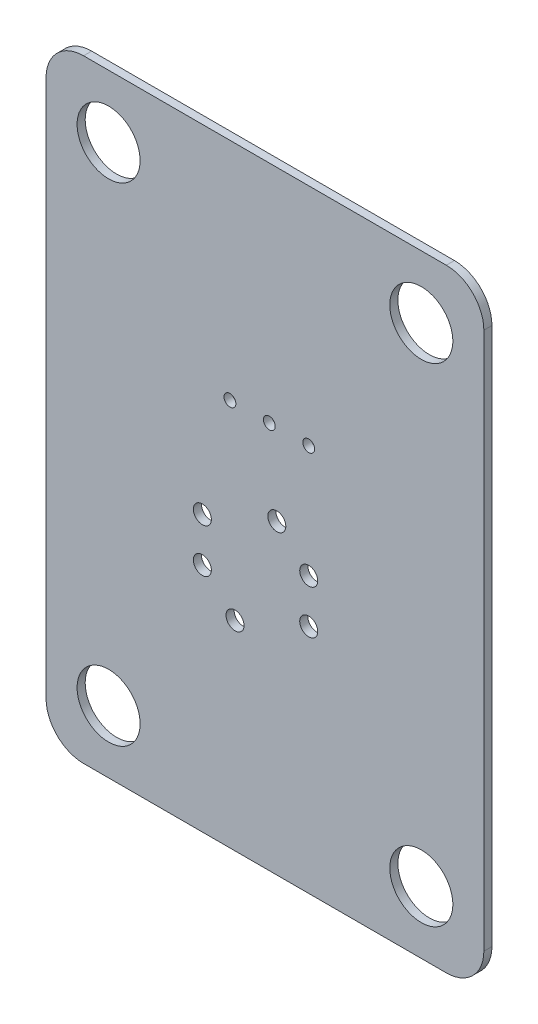
ISO-10303-21;
HEADER;
FILE_DESCRIPTION(('STEP AP214'),'2;1');
FILE_NAME('part.step','',(''),(''),'','','');
FILE_SCHEMA(('AUTOMOTIVE_DESIGN { 1 0 10303 214 1 1 1 1 }'));
ENDSEC;
DATA;
#1=APPLICATION_CONTEXT('core data for automotive mechanical design processes');
#2=APPLICATION_PROTOCOL_DEFINITION('international standard','automotive_design',2000,#1);
#3=PRODUCT_CONTEXT('',#1,'mechanical');
#4=PRODUCT('Part','Part','',(#3));
#5=PRODUCT_RELATED_PRODUCT_CATEGORY('part','',(#4));
#6=PRODUCT_DEFINITION_FORMATION('','',#4);
#7=PRODUCT_DEFINITION_CONTEXT('part definition',#1,'design');
#8=PRODUCT_DEFINITION('design','',#6,#7);
#9=PRODUCT_DEFINITION_SHAPE('','',#8);
#10=(LENGTH_UNIT() NAMED_UNIT(*) SI_UNIT(.MILLI.,.METRE.));
#11=(NAMED_UNIT(*) PLANE_ANGLE_UNIT() SI_UNIT($,.RADIAN.));
#12=(NAMED_UNIT(*) SI_UNIT($,.STERADIAN.) SOLID_ANGLE_UNIT());
#13=UNCERTAINTY_MEASURE_WITH_UNIT(LENGTH_MEASURE(1.E-05),#10,'distance_accuracy_value','');
#14=(GEOMETRIC_REPRESENTATION_CONTEXT(3) GLOBAL_UNCERTAINTY_ASSIGNED_CONTEXT((#13)) GLOBAL_UNIT_ASSIGNED_CONTEXT((#10,
#11,#12)) REPRESENTATION_CONTEXT('',''));
#15=CARTESIAN_POINT('',(0.,0.,0.));
#16=DIRECTION('',(0.,0.,1.));
#17=DIRECTION('',(1.,0.,0.));
#18=AXIS2_PLACEMENT_3D('',#15,#16,#17);
#19=CARTESIAN_POINT('',(27.305,27.305,0.41148));
#20=DIRECTION('',(0.,0.,-1.));
#21=DIRECTION('',(-1.,0.,0.));
#22=AXIS2_PLACEMENT_3D('',#19,#20,#21);
#23=CYLINDRICAL_SURFACE('',#22,1.905);
#24=CARTESIAN_POINT('',(27.305,27.305,0.));
#25=DIRECTION('',(0.,0.,1.));
#26=DIRECTION('',(-1.,0.,0.));
#27=AXIS2_PLACEMENT_3D('',#24,#25,#26);
#28=CIRCLE('',#27,1.905);
#29=CARTESIAN_POINT('',(25.4,27.305,0.));
#30=VERTEX_POINT('',#29);
#31=CARTESIAN_POINT('',(27.305,25.4,0.));
#32=VERTEX_POINT('',#31);
#33=EDGE_CURVE('E136',#30,#32,#28,.T.);
#34=ORIENTED_EDGE('',*,*,#33,.T.);
#35=DIRECTION('',(0.,0.,-1.));
#36=VECTOR('',#35,1.);
#37=CARTESIAN_POINT('',(27.305,25.4,0.41148));
#38=LINE('',#37,#36);
#39=CARTESIAN_POINT('',(27.305,25.4,0.41148));
#40=VERTEX_POINT('',#39);
#41=EDGE_CURVE('E11',#40,#32,#38,.T.);
#42=ORIENTED_EDGE('',*,*,#41,.F.);
#43=CARTESIAN_POINT('',(27.305,27.305,0.41148));
#44=DIRECTION('',(0.,0.,1.));
#45=DIRECTION('',(-1.,0.,0.));
#46=AXIS2_PLACEMENT_3D('',#43,#44,#45);
#47=CIRCLE('',#46,1.905);
#48=CARTESIAN_POINT('',(25.4,27.305,0.41148));
#49=VERTEX_POINT('',#48);
#50=EDGE_CURVE('E152',#49,#40,#47,.T.);
#51=ORIENTED_EDGE('',*,*,#50,.F.);
#52=DIRECTION('',(0.,0.,-1.));
#53=VECTOR('',#52,1.);
#54=CARTESIAN_POINT('',(25.4,27.305,0.41148));
#55=LINE('',#54,#53);
#56=EDGE_CURVE('E131',#49,#30,#55,.T.);
#57=ORIENTED_EDGE('',*,*,#56,.T.);
#58=EDGE_LOOP('',(#34,#42,#51,#57));
#59=FACE_BOUND('',#58,.T.);
#60=ADVANCED_FACE('F43',(#59),#23,.T.);
#61=CARTESIAN_POINT('',(45.72,25.4,0.41148));
#62=DIRECTION('',(0.,1.,0.));
#63=DIRECTION('',(0.,0.,1.));
#64=AXIS2_PLACEMENT_3D('',#61,#62,#63);
#65=PLANE('',#64);
#66=DIRECTION('',(1.,0.,0.));
#67=VECTOR('',#66,1.);
#68=CARTESIAN_POINT('',(45.72,25.4,0.));
#69=LINE('',#68,#67);
#70=CARTESIAN_POINT('',(45.72,25.4,0.));
#71=VERTEX_POINT('',#70);
#72=EDGE_CURVE('E142',#32,#71,#69,.T.);
#73=ORIENTED_EDGE('',*,*,#72,.T.);
#74=DIRECTION('',(0.,0.,-1.));
#75=VECTOR('',#74,1.);
#76=CARTESIAN_POINT('',(45.72,25.4,0.41148));
#77=LINE('',#76,#75);
#78=CARTESIAN_POINT('',(45.72,25.4,0.41148));
#79=VERTEX_POINT('',#78);
#80=EDGE_CURVE('E51',#79,#71,#77,.T.);
#81=ORIENTED_EDGE('',*,*,#80,.F.);
#82=DIRECTION('',(1.,0.,0.));
#83=VECTOR('',#82,1.);
#84=CARTESIAN_POINT('',(45.72,25.4,0.41148));
#85=LINE('',#84,#83);
#86=EDGE_CURVE('E105',#40,#79,#85,.T.);
#87=ORIENTED_EDGE('',*,*,#86,.F.);
#88=ORIENTED_EDGE('',*,*,#41,.T.);
#89=EDGE_LOOP('',(#73,#81,#87,#88));
#90=FACE_BOUND('',#89,.T.);
#91=ADVANCED_FACE('F310',(#90),#65,.F.);
#92=CARTESIAN_POINT('',(45.72,27.305,0.41148));
#93=DIRECTION('',(0.,0.,-1.));
#94=DIRECTION('',(-1.,0.,0.));
#95=AXIS2_PLACEMENT_3D('',#92,#93,#94);
#96=CYLINDRICAL_SURFACE('',#95,1.905);
#97=CARTESIAN_POINT('',(45.72,27.305,0.));
#98=DIRECTION('',(0.,0.,1.));
#99=DIRECTION('',(-1.,0.,0.));
#100=AXIS2_PLACEMENT_3D('',#97,#98,#99);
#101=CIRCLE('',#100,1.905);
#102=CARTESIAN_POINT('',(47.625,27.305,0.));
#103=VERTEX_POINT('',#102);
#104=EDGE_CURVE('E144',#71,#103,#101,.T.);
#105=ORIENTED_EDGE('',*,*,#104,.T.);
#106=DIRECTION('',(0.,0.,-1.));
#107=VECTOR('',#106,1.);
#108=CARTESIAN_POINT('',(47.625,27.305,0.41148));
#109=LINE('',#108,#107);
#110=CARTESIAN_POINT('',(47.625,27.305,0.41148));
#111=VERTEX_POINT('',#110);
#112=EDGE_CURVE('E161',#111,#103,#109,.T.);
#113=ORIENTED_EDGE('',*,*,#112,.F.);
#114=CARTESIAN_POINT('',(45.72,27.305,0.41148));
#115=DIRECTION('',(0.,0.,1.));
#116=DIRECTION('',(-1.,0.,0.));
#117=AXIS2_PLACEMENT_3D('',#114,#115,#116);
#118=CIRCLE('',#117,1.905);
#119=EDGE_CURVE('E166',#79,#111,#118,.T.);
#120=ORIENTED_EDGE('',*,*,#119,.F.);
#121=ORIENTED_EDGE('',*,*,#80,.T.);
#122=EDGE_LOOP('',(#105,#113,#120,#121));
#123=FACE_BOUND('',#122,.T.);
#124=ADVANCED_FACE('F170',(#123),#96,.T.);
#125=CARTESIAN_POINT('',(47.625,54.61,0.41148));
#126=DIRECTION('',(-1.,0.,0.));
#127=DIRECTION('',(0.,0.,1.));
#128=AXIS2_PLACEMENT_3D('',#125,#126,#127);
#129=PLANE('',#128);
#130=DIRECTION('',(0.,1.,0.));
#131=VECTOR('',#130,1.);
#132=CARTESIAN_POINT('',(47.625,54.61,0.));
#133=LINE('',#132,#131);
#134=CARTESIAN_POINT('',(47.625,54.61,0.));
#135=VERTEX_POINT('',#134);
#136=EDGE_CURVE('E150',#103,#135,#133,.T.);
#137=ORIENTED_EDGE('',*,*,#136,.T.);
#138=DIRECTION('',(0.,0.,-1.));
#139=VECTOR('',#138,1.);
#140=CARTESIAN_POINT('',(47.625,54.61,0.41148));
#141=LINE('',#140,#139);
#142=CARTESIAN_POINT('',(47.625,54.61,0.41148));
#143=VERTEX_POINT('',#142);
#144=EDGE_CURVE('E158',#143,#135,#141,.T.);
#145=ORIENTED_EDGE('',*,*,#144,.F.);
#146=DIRECTION('',(0.,1.,0.));
#147=VECTOR('',#146,1.);
#148=CARTESIAN_POINT('',(47.625,54.61,0.41148));
#149=LINE('',#148,#147);
#150=EDGE_CURVE('E182',#111,#143,#149,.T.);
#151=ORIENTED_EDGE('',*,*,#150,.F.);
#152=ORIENTED_EDGE('',*,*,#112,.T.);
#153=EDGE_LOOP('',(#137,#145,#151,#152));
#154=FACE_BOUND('',#153,.T.);
#155=ADVANCED_FACE('F180',(#154),#129,.F.);
#156=CARTESIAN_POINT('',(45.72,54.61,0.41148));
#157=DIRECTION('',(0.,0.,-1.));
#158=DIRECTION('',(-1.,0.,0.));
#159=AXIS2_PLACEMENT_3D('',#156,#157,#158);
#160=CYLINDRICAL_SURFACE('',#159,1.905);
#161=CARTESIAN_POINT('',(45.72,54.61,0.));
#162=DIRECTION('',(0.,0.,1.));
#163=DIRECTION('',(-1.,0.,0.));
#164=AXIS2_PLACEMENT_3D('',#161,#162,#163);
#165=CIRCLE('',#164,1.905);
#166=CARTESIAN_POINT('',(45.72,56.515,0.));
#167=VERTEX_POINT('',#166);
#168=EDGE_CURVE('E149',#135,#167,#165,.T.);
#169=ORIENTED_EDGE('',*,*,#168,.T.);
#170=DIRECTION('',(0.,0.,-1.));
#171=VECTOR('',#170,1.);
#172=CARTESIAN_POINT('',(45.72,56.515,0.41148));
#173=LINE('',#172,#171);
#174=CARTESIAN_POINT('',(45.72,56.515,0.41148));
#175=VERTEX_POINT('',#174);
#176=EDGE_CURVE('E128',#175,#167,#173,.T.);
#177=ORIENTED_EDGE('',*,*,#176,.F.);
#178=CARTESIAN_POINT('',(45.72,54.61,0.41148));
#179=DIRECTION('',(0.,0.,1.));
#180=DIRECTION('',(-1.,0.,0.));
#181=AXIS2_PLACEMENT_3D('',#178,#179,#180);
#182=CIRCLE('',#181,1.905);
#183=EDGE_CURVE('E122',#143,#175,#182,.T.);
#184=ORIENTED_EDGE('',*,*,#183,.F.);
#185=ORIENTED_EDGE('',*,*,#144,.T.);
#186=EDGE_LOOP('',(#169,#177,#184,#185));
#187=FACE_BOUND('',#186,.T.);
#188=ADVANCED_FACE('F178',(#187),#160,.T.);
#189=CARTESIAN_POINT('',(27.305,56.515,0.41148));
#190=DIRECTION('',(0.,-1.,0.));
#191=DIRECTION('',(0.,0.,-1.));
#192=AXIS2_PLACEMENT_3D('',#189,#190,#191);
#193=PLANE('',#192);
#194=DIRECTION('',(-1.,0.,0.));
#195=VECTOR('',#194,1.);
#196=CARTESIAN_POINT('',(27.305,56.515,0.));
#197=LINE('',#196,#195);
#198=CARTESIAN_POINT('',(27.305,56.515,0.));
#199=VERTEX_POINT('',#198);
#200=EDGE_CURVE('E129',#167,#199,#197,.T.);
#201=ORIENTED_EDGE('',*,*,#200,.T.);
#202=DIRECTION('',(0.,0.,-1.));
#203=VECTOR('',#202,1.);
#204=CARTESIAN_POINT('',(27.305,56.515,0.41148));
#205=LINE('',#204,#203);
#206=CARTESIAN_POINT('',(27.305,56.515,0.41148));
#207=VERTEX_POINT('',#206);
#208=EDGE_CURVE('E127',#207,#199,#205,.T.);
#209=ORIENTED_EDGE('',*,*,#208,.F.);
#210=DIRECTION('',(-1.,0.,0.));
#211=VECTOR('',#210,1.);
#212=CARTESIAN_POINT('',(27.305,56.515,0.41148));
#213=LINE('',#212,#211);
#214=EDGE_CURVE('E113',#175,#207,#213,.T.);
#215=ORIENTED_EDGE('',*,*,#214,.F.);
#216=ORIENTED_EDGE('',*,*,#176,.T.);
#217=EDGE_LOOP('',(#201,#209,#215,#216));
#218=FACE_BOUND('',#217,.T.);
#219=ADVANCED_FACE('F130',(#218),#193,.F.);
#220=CARTESIAN_POINT('',(27.305,54.61,0.41148));
#221=DIRECTION('',(0.,0.,-1.));
#222=DIRECTION('',(-1.,0.,0.));
#223=AXIS2_PLACEMENT_3D('',#220,#221,#222);
#224=CYLINDRICAL_SURFACE('',#223,1.905);
#225=CARTESIAN_POINT('',(27.305,54.61,0.));
#226=DIRECTION('',(0.,0.,1.));
#227=DIRECTION('',(-1.,0.,0.));
#228=AXIS2_PLACEMENT_3D('',#225,#226,#227);
#229=CIRCLE('',#228,1.905);
#230=CARTESIAN_POINT('',(25.4,54.61,0.));
#231=VERTEX_POINT('',#230);
#232=EDGE_CURVE('E86',#199,#231,#229,.T.);
#233=ORIENTED_EDGE('',*,*,#232,.T.);
#234=DIRECTION('',(0.,0.,-1.));
#235=VECTOR('',#234,1.);
#236=CARTESIAN_POINT('',(25.4,54.61,0.41148));
#237=LINE('',#236,#235);
#238=CARTESIAN_POINT('',(25.4,54.61,0.41148));
#239=VERTEX_POINT('',#238);
#240=EDGE_CURVE('E133',#239,#231,#237,.T.);
#241=ORIENTED_EDGE('',*,*,#240,.F.);
#242=CARTESIAN_POINT('',(27.305,54.61,0.41148));
#243=DIRECTION('',(0.,0.,1.));
#244=DIRECTION('',(-1.,0.,0.));
#245=AXIS2_PLACEMENT_3D('',#242,#243,#244);
#246=CIRCLE('',#245,1.905);
#247=EDGE_CURVE('E120',#207,#239,#246,.T.);
#248=ORIENTED_EDGE('',*,*,#247,.F.);
#249=ORIENTED_EDGE('',*,*,#208,.T.);
#250=EDGE_LOOP('',(#233,#241,#248,#249));
#251=FACE_BOUND('',#250,.T.);
#252=ADVANCED_FACE('F132',(#251),#224,.T.);
#253=CARTESIAN_POINT('',(25.4,27.305,0.41148));
#254=DIRECTION('',(1.,0.,0.));
#255=DIRECTION('',(0.,0.,-1.));
#256=AXIS2_PLACEMENT_3D('',#253,#254,#255);
#257=PLANE('',#256);
#258=DIRECTION('',(0.,-1.,0.));
#259=VECTOR('',#258,1.);
#260=CARTESIAN_POINT('',(25.4,27.305,0.));
#261=LINE('',#260,#259);
#262=EDGE_CURVE('E94',#231,#30,#261,.T.);
#263=ORIENTED_EDGE('',*,*,#262,.T.);
#264=ORIENTED_EDGE('',*,*,#56,.F.);
#265=DIRECTION('',(0.,-1.,0.));
#266=VECTOR('',#265,1.);
#267=CARTESIAN_POINT('',(25.4,27.305,0.41148));
#268=LINE('',#267,#266);
#269=EDGE_CURVE('E56',#239,#49,#268,.T.);
#270=ORIENTED_EDGE('',*,*,#269,.F.);
#271=ORIENTED_EDGE('',*,*,#240,.T.);
#272=EDGE_LOOP('',(#263,#264,#270,#271));
#273=FACE_BOUND('',#272,.T.);
#274=ADVANCED_FACE('F316',(#273),#257,.F.);
#275=CARTESIAN_POINT('',(27.305,27.305,0.41148));
#276=DIRECTION('',(0.,0.,-1.));
#277=DIRECTION('',(-1.,0.,0.));
#278=AXIS2_PLACEMENT_3D('',#275,#276,#277);
#279=PLANE('',#278);
#280=CARTESIAN_POINT('',(38.735,39.37,0.411480000000006));
#281=DIRECTION('',(0.,0.,-1.));
#282=DIRECTION('',(-1.,0.,0.));
#283=AXIS2_PLACEMENT_3D('',#280,#281,#282);
#284=CIRCLE('',#283,0.457199999999991);
#285=CARTESIAN_POINT('',(38.2778,39.37,0.411480000000006));
#286=VERTEX_POINT('',#285);
#287=EDGE_CURVE('E256',#286,#286,#284,.T.);
#288=ORIENTED_EDGE('',*,*,#287,.T.);
#289=EDGE_LOOP('',(#288));
#290=FACE_BOUND('',#289,.T.);
#291=CARTESIAN_POINT('',(33.33501,39.37,0.411480000000006));
#292=DIRECTION('',(0.,0.,-1.));
#293=DIRECTION('',(-1.,0.,0.));
#294=AXIS2_PLACEMENT_3D('',#291,#292,#293);
#295=CIRCLE('',#294,0.457199999999991);
#296=CARTESIAN_POINT('',(32.87781,39.37,0.411480000000006));
#297=VERTEX_POINT('',#296);
#298=EDGE_CURVE('E252',#297,#297,#295,.T.);
#299=ORIENTED_EDGE('',*,*,#298,.T.);
#300=EDGE_LOOP('',(#299));
#301=FACE_BOUND('',#300,.T.);
#302=CARTESIAN_POINT('',(38.735,37.13998,0.411480000000006));
#303=DIRECTION('',(0.,0.,-1.));
#304=DIRECTION('',(-1.,0.,0.));
#305=AXIS2_PLACEMENT_3D('',#302,#303,#304);
#306=CIRCLE('',#305,0.457199999999991);
#307=CARTESIAN_POINT('',(38.2778,37.13998,0.411480000000006));
#308=VERTEX_POINT('',#307);
#309=EDGE_CURVE('E247',#308,#308,#306,.T.);
#310=ORIENTED_EDGE('',*,*,#309,.T.);
#311=EDGE_LOOP('',(#310));
#312=FACE_BOUND('',#311,.T.);
#313=CARTESIAN_POINT('',(37.11501,40.95499,0.411480000000006));
#314=DIRECTION('',(0.,0.,-1.));
#315=DIRECTION('',(-1.,0.,0.));
#316=AXIS2_PLACEMENT_3D('',#313,#314,#315);
#317=CIRCLE('',#316,0.457199999999991);
#318=CARTESIAN_POINT('',(36.65781,40.95499,0.411480000000006));
#319=VERTEX_POINT('',#318);
#320=EDGE_CURVE('E238',#319,#319,#317,.T.);
#321=ORIENTED_EDGE('',*,*,#320,.T.);
#322=EDGE_LOOP('',(#321));
#323=FACE_BOUND('',#322,.T.);
#324=CARTESIAN_POINT('',(33.33501,37.13998,0.411480000000006));
#325=DIRECTION('',(0.,0.,-1.));
#326=DIRECTION('',(-1.,0.,0.));
#327=AXIS2_PLACEMENT_3D('',#324,#325,#326);
#328=CIRCLE('',#327,0.457199999999991);
#329=CARTESIAN_POINT('',(32.87781,37.13998,0.411480000000006));
#330=VERTEX_POINT('',#329);
#331=EDGE_CURVE('E231',#330,#330,#328,.T.);
#332=ORIENTED_EDGE('',*,*,#331,.T.);
#333=EDGE_LOOP('',(#332));
#334=FACE_BOUND('',#333,.T.);
#335=CARTESIAN_POINT('',(34.995,35.53501,0.411480000000006));
#336=DIRECTION('',(0.,0.,-1.));
#337=DIRECTION('',(-1.,0.,0.));
#338=AXIS2_PLACEMENT_3D('',#335,#336,#337);
#339=CIRCLE('',#338,0.457199999999991);
#340=CARTESIAN_POINT('',(34.5378,35.53501,0.411480000000006));
#341=VERTEX_POINT('',#340);
#342=EDGE_CURVE('E227',#341,#341,#339,.T.);
#343=ORIENTED_EDGE('',*,*,#342,.T.);
#344=EDGE_LOOP('',(#343));
#345=FACE_BOUND('',#344,.T.);
#346=CARTESIAN_POINT('',(28.575,53.34,0.411480000000006));
#347=DIRECTION('',(0.,0.,-1.));
#348=DIRECTION('',(-1.,0.,0.));
#349=AXIS2_PLACEMENT_3D('',#346,#347,#348);
#350=CIRCLE('',#349,1.60019999999999);
#351=CARTESIAN_POINT('',(26.9748,53.34,0.411480000000006));
#352=VERTEX_POINT('',#351);
#353=EDGE_CURVE('E225',#352,#352,#350,.T.);
#354=ORIENTED_EDGE('',*,*,#353,.T.);
#355=EDGE_LOOP('',(#354));
#356=FACE_BOUND('',#355,.T.);
#357=CARTESIAN_POINT('',(28.575,28.575,0.411480000000006));
#358=DIRECTION('',(0.,0.,-1.));
#359=DIRECTION('',(-1.,0.,0.));
#360=AXIS2_PLACEMENT_3D('',#357,#358,#359);
#361=CIRCLE('',#360,1.60019999999999);
#362=CARTESIAN_POINT('',(26.9748,28.575,0.411480000000006));
#363=VERTEX_POINT('',#362);
#364=EDGE_CURVE('E216',#363,#363,#361,.T.);
#365=ORIENTED_EDGE('',*,*,#364,.T.);
#366=EDGE_LOOP('',(#365));
#367=FACE_BOUND('',#366,.T.);
#368=CARTESIAN_POINT('',(44.45,28.575,0.411480000000006));
#369=DIRECTION('',(0.,0.,-1.));
#370=DIRECTION('',(-1.,0.,0.));
#371=AXIS2_PLACEMENT_3D('',#368,#369,#370);
#372=CIRCLE('',#371,1.60019999999999);
#373=CARTESIAN_POINT('',(42.8498,28.575,0.411480000000006));
#374=VERTEX_POINT('',#373);
#375=EDGE_CURVE('E209',#374,#374,#372,.T.);
#376=ORIENTED_EDGE('',*,*,#375,.T.);
#377=EDGE_LOOP('',(#376));
#378=FACE_BOUND('',#377,.T.);
#379=CARTESIAN_POINT('',(44.45,53.34,0.411480000000006));
#380=DIRECTION('',(0.,0.,-1.));
#381=DIRECTION('',(-1.,0.,0.));
#382=AXIS2_PLACEMENT_3D('',#379,#380,#381);
#383=CIRCLE('',#382,1.60019999999999);
#384=CARTESIAN_POINT('',(42.8498,53.34,0.411480000000006));
#385=VERTEX_POINT('',#384);
#386=EDGE_CURVE('E204',#385,#385,#383,.T.);
#387=ORIENTED_EDGE('',*,*,#386,.T.);
#388=EDGE_LOOP('',(#387));
#389=FACE_BOUND('',#388,.T.);
#390=CARTESIAN_POINT('',(34.735,45.085,0.411480000000006));
#391=DIRECTION('',(0.,0.,-1.));
#392=DIRECTION('',(-1.,0.,0.));
#393=AXIS2_PLACEMENT_3D('',#390,#391,#392);
#394=CIRCLE('',#393,0.299999999999988);
#395=CARTESIAN_POINT('',(34.435,45.085,0.411480000000006));
#396=VERTEX_POINT('',#395);
#397=EDGE_CURVE('E196',#396,#396,#394,.T.);
#398=ORIENTED_EDGE('',*,*,#397,.T.);
#399=EDGE_LOOP('',(#398));
#400=FACE_BOUND('',#399,.T.);
#401=CARTESIAN_POINT('',(38.735,45.085,0.411480000000006));
#402=DIRECTION('',(0.,0.,-1.));
#403=DIRECTION('',(-1.,0.,0.));
#404=AXIS2_PLACEMENT_3D('',#401,#402,#403);
#405=CIRCLE('',#404,0.299999999999988);
#406=CARTESIAN_POINT('',(38.435,45.085,0.411480000000006));
#407=VERTEX_POINT('',#406);
#408=EDGE_CURVE('E195',#407,#407,#405,.T.);
#409=ORIENTED_EDGE('',*,*,#408,.T.);
#410=EDGE_LOOP('',(#409));
#411=FACE_BOUND('',#410,.T.);
#412=CARTESIAN_POINT('',(36.735,45.085,0.411480000000006));
#413=DIRECTION('',(0.,0.,-1.));
#414=DIRECTION('',(-1.,0.,0.));
#415=AXIS2_PLACEMENT_3D('',#412,#413,#414);
#416=CIRCLE('',#415,0.299999999999988);
#417=CARTESIAN_POINT('',(36.435,45.085,0.411480000000006));
#418=VERTEX_POINT('',#417);
#419=EDGE_CURVE('E141',#418,#418,#416,.T.);
#420=ORIENTED_EDGE('',*,*,#419,.T.);
#421=EDGE_LOOP('',(#420));
#422=FACE_BOUND('',#421,.T.);
#423=ORIENTED_EDGE('',*,*,#50,.T.);
#424=ORIENTED_EDGE('',*,*,#86,.T.);
#425=ORIENTED_EDGE('',*,*,#119,.T.);
#426=ORIENTED_EDGE('',*,*,#150,.T.);
#427=ORIENTED_EDGE('',*,*,#183,.T.);
#428=ORIENTED_EDGE('',*,*,#214,.T.);
#429=ORIENTED_EDGE('',*,*,#247,.T.);
#430=ORIENTED_EDGE('',*,*,#269,.T.);
#431=EDGE_LOOP('',(#423,#424,#425,#426,#427,#428,#429,#430));
#432=FACE_BOUND('',#431,.T.);
#433=ADVANCED_FACE('F119',(#290,#301,#312,#323,#334,#345,#356,#367,#378,#389,#400,#411,#422,
#432),#279,.F.);
#434=CARTESIAN_POINT('',(27.305,27.305,0.));
#435=DIRECTION('',(0.,0.,-1.));
#436=DIRECTION('',(-1.,0.,0.));
#437=AXIS2_PLACEMENT_3D('',#434,#435,#436);
#438=PLANE('',#437);
#439=CARTESIAN_POINT('',(38.735,39.37,0.));
#440=DIRECTION('',(0.,0.,-1.));
#441=DIRECTION('',(-1.,0.,0.));
#442=AXIS2_PLACEMENT_3D('',#439,#440,#441);
#443=CIRCLE('',#442,0.457199999999984);
#444=CARTESIAN_POINT('',(38.2778,39.37,0.));
#445=VERTEX_POINT('',#444);
#446=EDGE_CURVE('E261',#445,#445,#443,.T.);
#447=ORIENTED_EDGE('',*,*,#446,.F.);
#448=EDGE_LOOP('',(#447));
#449=FACE_BOUND('',#448,.T.);
#450=CARTESIAN_POINT('',(33.33501,39.37,0.));
#451=DIRECTION('',(0.,0.,-1.));
#452=DIRECTION('',(-1.,0.,0.));
#453=AXIS2_PLACEMENT_3D('',#450,#451,#452);
#454=CIRCLE('',#453,0.457199999999991);
#455=CARTESIAN_POINT('',(32.87781,39.37,0.));
#456=VERTEX_POINT('',#455);
#457=EDGE_CURVE('E254',#456,#456,#454,.T.);
#458=ORIENTED_EDGE('',*,*,#457,.F.);
#459=EDGE_LOOP('',(#458));
#460=FACE_BOUND('',#459,.T.);
#461=CARTESIAN_POINT('',(38.735,37.13998,0.));
#462=DIRECTION('',(0.,0.,-1.));
#463=DIRECTION('',(-1.,0.,0.));
#464=AXIS2_PLACEMENT_3D('',#461,#462,#463);
#465=CIRCLE('',#464,0.457199999999984);
#466=CARTESIAN_POINT('',(38.2778,37.13998,0.));
#467=VERTEX_POINT('',#466);
#468=EDGE_CURVE('E246',#467,#467,#465,.T.);
#469=ORIENTED_EDGE('',*,*,#468,.F.);
#470=EDGE_LOOP('',(#469));
#471=FACE_BOUND('',#470,.T.);
#472=CARTESIAN_POINT('',(37.11501,40.95499,0.));
#473=DIRECTION('',(0.,0.,-1.));
#474=DIRECTION('',(-1.,0.,0.));
#475=AXIS2_PLACEMENT_3D('',#472,#473,#474);
#476=CIRCLE('',#475,0.457199999999984);
#477=CARTESIAN_POINT('',(36.65781,40.95499,0.));
#478=VERTEX_POINT('',#477);
#479=EDGE_CURVE('E242',#478,#478,#476,.T.);
#480=ORIENTED_EDGE('',*,*,#479,.F.);
#481=EDGE_LOOP('',(#480));
#482=FACE_BOUND('',#481,.T.);
#483=CARTESIAN_POINT('',(33.33501,37.13998,0.));
#484=DIRECTION('',(0.,0.,-1.));
#485=DIRECTION('',(-1.,0.,0.));
#486=AXIS2_PLACEMENT_3D('',#483,#484,#485);
#487=CIRCLE('',#486,0.457199999999991);
#488=CARTESIAN_POINT('',(32.87781,37.13998,0.));
#489=VERTEX_POINT('',#488);
#490=EDGE_CURVE('E240',#489,#489,#487,.T.);
#491=ORIENTED_EDGE('',*,*,#490,.F.);
#492=EDGE_LOOP('',(#491));
#493=FACE_BOUND('',#492,.T.);
#494=CARTESIAN_POINT('',(34.995,35.53501,0.));
#495=DIRECTION('',(0.,0.,-1.));
#496=DIRECTION('',(-1.,0.,0.));
#497=AXIS2_PLACEMENT_3D('',#494,#495,#496);
#498=CIRCLE('',#497,0.457199999999991);
#499=CARTESIAN_POINT('',(34.5378,35.53501,0.));
#500=VERTEX_POINT('',#499);
#501=EDGE_CURVE('E232',#500,#500,#498,.T.);
#502=ORIENTED_EDGE('',*,*,#501,.F.);
#503=EDGE_LOOP('',(#502));
#504=FACE_BOUND('',#503,.T.);
#505=CARTESIAN_POINT('',(28.575,53.34,0.));
#506=DIRECTION('',(0.,0.,-1.));
#507=DIRECTION('',(-1.,0.,0.));
#508=AXIS2_PLACEMENT_3D('',#505,#506,#507);
#509=CIRCLE('',#508,1.60019999999999);
#510=CARTESIAN_POINT('',(26.9748,53.34,0.));
#511=VERTEX_POINT('',#510);
#512=EDGE_CURVE('E223',#511,#511,#509,.T.);
#513=ORIENTED_EDGE('',*,*,#512,.F.);
#514=EDGE_LOOP('',(#513));
#515=FACE_BOUND('',#514,.T.);
#516=CARTESIAN_POINT('',(28.575,28.575,0.));
#517=DIRECTION('',(0.,0.,-1.));
#518=DIRECTION('',(-1.,0.,0.));
#519=AXIS2_PLACEMENT_3D('',#516,#517,#518);
#520=CIRCLE('',#519,1.60019999999999);
#521=CARTESIAN_POINT('',(26.9748,28.575,0.));
#522=VERTEX_POINT('',#521);
#523=EDGE_CURVE('E218',#522,#522,#520,.T.);
#524=ORIENTED_EDGE('',*,*,#523,.F.);
#525=EDGE_LOOP('',(#524));
#526=FACE_BOUND('',#525,.T.);
#527=CARTESIAN_POINT('',(44.45,28.575,0.));
#528=DIRECTION('',(0.,0.,-1.));
#529=DIRECTION('',(-1.,0.,0.));
#530=AXIS2_PLACEMENT_3D('',#527,#528,#529);
#531=CIRCLE('',#530,1.60019999999999);
#532=CARTESIAN_POINT('',(42.8498,28.575,0.));
#533=VERTEX_POINT('',#532);
#534=EDGE_CURVE('E213',#533,#533,#531,.T.);
#535=ORIENTED_EDGE('',*,*,#534,.F.);
#536=EDGE_LOOP('',(#535));
#537=FACE_BOUND('',#536,.T.);
#538=CARTESIAN_POINT('',(44.45,53.34,0.));
#539=DIRECTION('',(0.,0.,-1.));
#540=DIRECTION('',(-1.,0.,0.));
#541=AXIS2_PLACEMENT_3D('',#538,#539,#540);
#542=CIRCLE('',#541,1.60019999999999);
#543=CARTESIAN_POINT('',(42.8498,53.34,0.));
#544=VERTEX_POINT('',#543);
#545=EDGE_CURVE('E210',#544,#544,#542,.T.);
#546=ORIENTED_EDGE('',*,*,#545,.F.);
#547=EDGE_LOOP('',(#546));
#548=FACE_BOUND('',#547,.T.);
#549=CARTESIAN_POINT('',(34.735,45.085,0.));
#550=DIRECTION('',(0.,0.,-1.));
#551=DIRECTION('',(-1.,0.,0.));
#552=AXIS2_PLACEMENT_3D('',#549,#550,#551);
#553=CIRCLE('',#552,0.299999999999988);
#554=CARTESIAN_POINT('',(34.435,45.085,0.));
#555=VERTEX_POINT('',#554);
#556=EDGE_CURVE('E203',#555,#555,#553,.T.);
#557=ORIENTED_EDGE('',*,*,#556,.F.);
#558=EDGE_LOOP('',(#557));
#559=FACE_BOUND('',#558,.T.);
#560=CARTESIAN_POINT('',(38.735,45.085,0.));
#561=DIRECTION('',(0.,0.,-1.));
#562=DIRECTION('',(-1.,0.,0.));
#563=AXIS2_PLACEMENT_3D('',#560,#561,#562);
#564=CIRCLE('',#563,0.299999999999988);
#565=CARTESIAN_POINT('',(38.435,45.085,0.));
#566=VERTEX_POINT('',#565);
#567=EDGE_CURVE('E193',#566,#566,#564,.T.);
#568=ORIENTED_EDGE('',*,*,#567,.F.);
#569=EDGE_LOOP('',(#568));
#570=FACE_BOUND('',#569,.T.);
#571=CARTESIAN_POINT('',(36.735,45.085,0.));
#572=DIRECTION('',(0.,0.,-1.));
#573=DIRECTION('',(-1.,0.,0.));
#574=AXIS2_PLACEMENT_3D('',#571,#572,#573);
#575=CIRCLE('',#574,0.299999999999988);
#576=CARTESIAN_POINT('',(36.435,45.085,0.));
#577=VERTEX_POINT('',#576);
#578=EDGE_CURVE('E190',#577,#577,#575,.T.);
#579=ORIENTED_EDGE('',*,*,#578,.F.);
#580=EDGE_LOOP('',(#579));
#581=FACE_BOUND('',#580,.T.);
#582=ORIENTED_EDGE('',*,*,#33,.F.);
#583=ORIENTED_EDGE('',*,*,#262,.F.);
#584=ORIENTED_EDGE('',*,*,#232,.F.);
#585=ORIENTED_EDGE('',*,*,#200,.F.);
#586=ORIENTED_EDGE('',*,*,#168,.F.);
#587=ORIENTED_EDGE('',*,*,#136,.F.);
#588=ORIENTED_EDGE('',*,*,#104,.F.);
#589=ORIENTED_EDGE('',*,*,#72,.F.);
#590=EDGE_LOOP('',(#582,#583,#584,#585,#586,#587,#588,#589));
#591=FACE_BOUND('',#590,.T.);
#592=ADVANCED_FACE('F172',(#449,#460,#471,#482,#493,#504,#515,#526,#537,#548,#559,#570,#581,
#591),#438,.T.);
#593=CARTESIAN_POINT('',(36.735,45.085,0.));
#594=DIRECTION('',(0.,0.,-1.));
#595=DIRECTION('',(-1.,0.,0.));
#596=AXIS2_PLACEMENT_3D('',#593,#594,#595);
#597=CYLINDRICAL_SURFACE('',#596,0.299999999999988);
#598=ORIENTED_EDGE('',*,*,#419,.F.);
#599=EDGE_LOOP('',(#598));
#600=FACE_BOUND('',#599,.T.);
#601=ORIENTED_EDGE('',*,*,#578,.T.);
#602=EDGE_LOOP('',(#601));
#603=FACE_BOUND('',#602,.T.);
#604=ADVANCED_FACE('F267',(#600,#603),#597,.F.);
#605=CARTESIAN_POINT('',(38.735,45.085,0.));
#606=DIRECTION('',(0.,0.,-1.));
#607=DIRECTION('',(-1.,0.,0.));
#608=AXIS2_PLACEMENT_3D('',#605,#606,#607);
#609=CYLINDRICAL_SURFACE('',#608,0.299999999999988);
#610=ORIENTED_EDGE('',*,*,#408,.F.);
#611=EDGE_LOOP('',(#610));
#612=FACE_BOUND('',#611,.T.);
#613=ORIENTED_EDGE('',*,*,#567,.T.);
#614=EDGE_LOOP('',(#613));
#615=FACE_BOUND('',#614,.T.);
#616=ADVANCED_FACE('F298',(#612,#615),#609,.F.);
#617=CARTESIAN_POINT('',(34.735,45.085,0.));
#618=DIRECTION('',(0.,0.,-1.));
#619=DIRECTION('',(-1.,0.,0.));
#620=AXIS2_PLACEMENT_3D('',#617,#618,#619);
#621=CYLINDRICAL_SURFACE('',#620,0.299999999999988);
#622=ORIENTED_EDGE('',*,*,#397,.F.);
#623=EDGE_LOOP('',(#622));
#624=FACE_BOUND('',#623,.T.);
#625=ORIENTED_EDGE('',*,*,#556,.T.);
#626=EDGE_LOOP('',(#625));
#627=FACE_BOUND('',#626,.T.);
#628=ADVANCED_FACE('F304',(#624,#627),#621,.F.);
#629=CARTESIAN_POINT('',(44.45,53.34,0.));
#630=DIRECTION('',(0.,0.,-1.));
#631=DIRECTION('',(-1.,0.,0.));
#632=AXIS2_PLACEMENT_3D('',#629,#630,#631);
#633=CYLINDRICAL_SURFACE('',#632,1.60019999999999);
#634=ORIENTED_EDGE('',*,*,#386,.F.);
#635=EDGE_LOOP('',(#634));
#636=FACE_BOUND('',#635,.T.);
#637=ORIENTED_EDGE('',*,*,#545,.T.);
#638=EDGE_LOOP('',(#637));
#639=FACE_BOUND('',#638,.T.);
#640=ADVANCED_FACE('F395',(#636,#639),#633,.F.);
#641=CARTESIAN_POINT('',(44.45,28.575,0.));
#642=DIRECTION('',(0.,0.,-1.));
#643=DIRECTION('',(-1.,0.,0.));
#644=AXIS2_PLACEMENT_3D('',#641,#642,#643);
#645=CYLINDRICAL_SURFACE('',#644,1.60019999999999);
#646=ORIENTED_EDGE('',*,*,#375,.F.);
#647=EDGE_LOOP('',(#646));
#648=FACE_BOUND('',#647,.T.);
#649=ORIENTED_EDGE('',*,*,#534,.T.);
#650=EDGE_LOOP('',(#649));
#651=FACE_BOUND('',#650,.T.);
#652=ADVANCED_FACE('F404',(#648,#651),#645,.F.);
#653=CARTESIAN_POINT('',(28.575,28.575,0.));
#654=DIRECTION('',(0.,0.,-1.));
#655=DIRECTION('',(-1.,0.,0.));
#656=AXIS2_PLACEMENT_3D('',#653,#654,#655);
#657=CYLINDRICAL_SURFACE('',#656,1.60019999999999);
#658=ORIENTED_EDGE('',*,*,#364,.F.);
#659=EDGE_LOOP('',(#658));
#660=FACE_BOUND('',#659,.T.);
#661=ORIENTED_EDGE('',*,*,#523,.T.);
#662=EDGE_LOOP('',(#661));
#663=FACE_BOUND('',#662,.T.);
#664=ADVANCED_FACE('F411',(#660,#663),#657,.F.);
#665=CARTESIAN_POINT('',(28.575,53.34,0.));
#666=DIRECTION('',(0.,0.,-1.));
#667=DIRECTION('',(-1.,0.,0.));
#668=AXIS2_PLACEMENT_3D('',#665,#666,#667);
#669=CYLINDRICAL_SURFACE('',#668,1.60019999999999);
#670=ORIENTED_EDGE('',*,*,#353,.F.);
#671=EDGE_LOOP('',(#670));
#672=FACE_BOUND('',#671,.T.);
#673=ORIENTED_EDGE('',*,*,#512,.T.);
#674=EDGE_LOOP('',(#673));
#675=FACE_BOUND('',#674,.T.);
#676=ADVANCED_FACE('F424',(#672,#675),#669,.F.);
#677=CARTESIAN_POINT('',(34.995,35.53501,0.));
#678=DIRECTION('',(0.,0.,-1.));
#679=DIRECTION('',(-1.,0.,0.));
#680=AXIS2_PLACEMENT_3D('',#677,#678,#679);
#681=CYLINDRICAL_SURFACE('',#680,0.457199999999991);
#682=ORIENTED_EDGE('',*,*,#342,.F.);
#683=EDGE_LOOP('',(#682));
#684=FACE_BOUND('',#683,.T.);
#685=ORIENTED_EDGE('',*,*,#501,.T.);
#686=EDGE_LOOP('',(#685));
#687=FACE_BOUND('',#686,.T.);
#688=ADVANCED_FACE('F432',(#684,#687),#681,.F.);
#689=CARTESIAN_POINT('',(33.33501,37.13998,0.));
#690=DIRECTION('',(0.,0.,-1.));
#691=DIRECTION('',(-1.,0.,0.));
#692=AXIS2_PLACEMENT_3D('',#689,#690,#691);
#693=CYLINDRICAL_SURFACE('',#692,0.457199999999991);
#694=ORIENTED_EDGE('',*,*,#331,.F.);
#695=EDGE_LOOP('',(#694));
#696=FACE_BOUND('',#695,.T.);
#697=ORIENTED_EDGE('',*,*,#490,.T.);
#698=EDGE_LOOP('',(#697));
#699=FACE_BOUND('',#698,.T.);
#700=ADVANCED_FACE('F441',(#696,#699),#693,.F.);
#701=CARTESIAN_POINT('',(37.11501,40.95499,0.));
#702=DIRECTION('',(0.,0.,-1.));
#703=DIRECTION('',(-1.,0.,0.));
#704=AXIS2_PLACEMENT_3D('',#701,#702,#703);
#705=CYLINDRICAL_SURFACE('',#704,0.457199999999988);
#706=ORIENTED_EDGE('',*,*,#320,.F.);
#707=EDGE_LOOP('',(#706));
#708=FACE_BOUND('',#707,.T.);
#709=ORIENTED_EDGE('',*,*,#479,.T.);
#710=EDGE_LOOP('',(#709));
#711=FACE_BOUND('',#710,.T.);
#712=ADVANCED_FACE('F451',(#708,#711),#705,.F.);
#713=CARTESIAN_POINT('',(38.735,37.13998,0.));
#714=DIRECTION('',(0.,0.,-1.));
#715=DIRECTION('',(-1.,0.,0.));
#716=AXIS2_PLACEMENT_3D('',#713,#714,#715);
#717=CYLINDRICAL_SURFACE('',#716,0.457199999999988);
#718=ORIENTED_EDGE('',*,*,#309,.F.);
#719=EDGE_LOOP('',(#718));
#720=FACE_BOUND('',#719,.T.);
#721=ORIENTED_EDGE('',*,*,#468,.T.);
#722=EDGE_LOOP('',(#721));
#723=FACE_BOUND('',#722,.T.);
#724=ADVANCED_FACE('F465',(#720,#723),#717,.F.);
#725=CARTESIAN_POINT('',(33.33501,39.37,0.));
#726=DIRECTION('',(0.,0.,-1.));
#727=DIRECTION('',(-1.,0.,0.));
#728=AXIS2_PLACEMENT_3D('',#725,#726,#727);
#729=CYLINDRICAL_SURFACE('',#728,0.457199999999991);
#730=ORIENTED_EDGE('',*,*,#298,.F.);
#731=EDGE_LOOP('',(#730));
#732=FACE_BOUND('',#731,.T.);
#733=ORIENTED_EDGE('',*,*,#457,.T.);
#734=EDGE_LOOP('',(#733));
#735=FACE_BOUND('',#734,.T.);
#736=ADVANCED_FACE('F475',(#732,#735),#729,.F.);
#737=CARTESIAN_POINT('',(38.735,39.37,0.));
#738=DIRECTION('',(0.,0.,-1.));
#739=DIRECTION('',(-1.,0.,0.));
#740=AXIS2_PLACEMENT_3D('',#737,#738,#739);
#741=CYLINDRICAL_SURFACE('',#740,0.457199999999988);
#742=ORIENTED_EDGE('',*,*,#287,.F.);
#743=EDGE_LOOP('',(#742));
#744=FACE_BOUND('',#743,.T.);
#745=ORIENTED_EDGE('',*,*,#446,.T.);
#746=EDGE_LOOP('',(#745));
#747=FACE_BOUND('',#746,.T.);
#748=ADVANCED_FACE('F264',(#744,#747),#741,.F.);
#749=CLOSED_SHELL('',(#60,#91,#124,#155,#188,#219,#252,#274,#433,#592,#604,#616,#628,#640,#652,
#664,#676,#688,#700,#712,#724,#736,#748));
#750=MANIFOLD_SOLID_BREP('B2',#749);
#751=ADVANCED_BREP_SHAPE_REPRESENTATION('',(#18,#750),#14);
#752=SHAPE_DEFINITION_REPRESENTATION(#9,#751);
ENDSEC;
END-ISO-10303-21;
